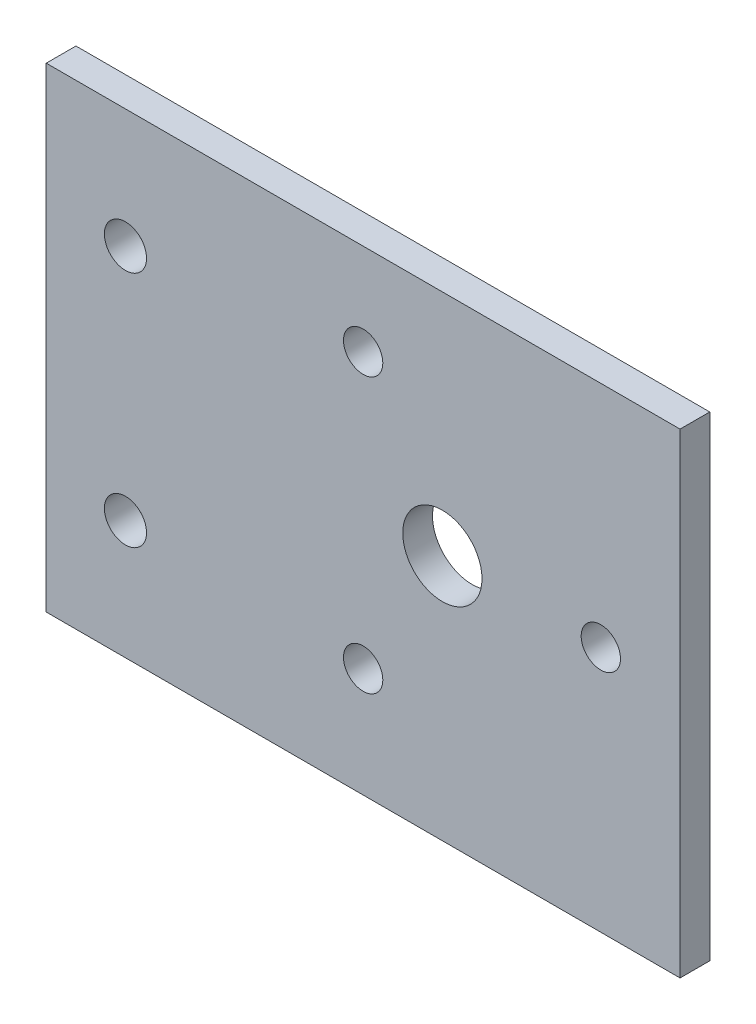
ISO-10303-21;
HEADER;
FILE_DESCRIPTION(('STEP AP214'),'2;1');
FILE_NAME('part.step','',(''),(''),'','','');
FILE_SCHEMA(('AUTOMOTIVE_DESIGN { 1 0 10303 214 1 1 1 1 }'));
ENDSEC;
DATA;
#1=APPLICATION_CONTEXT('core data for automotive mechanical design processes');
#2=APPLICATION_PROTOCOL_DEFINITION('international standard','automotive_design',2000,#1);
#3=PRODUCT_CONTEXT('',#1,'mechanical');
#4=PRODUCT('Part','Part','',(#3));
#5=PRODUCT_RELATED_PRODUCT_CATEGORY('part','',(#4));
#6=PRODUCT_DEFINITION_FORMATION('','',#4);
#7=PRODUCT_DEFINITION_CONTEXT('part definition',#1,'design');
#8=PRODUCT_DEFINITION('design','',#6,#7);
#9=PRODUCT_DEFINITION_SHAPE('','',#8);
#10=(LENGTH_UNIT() NAMED_UNIT(*) SI_UNIT(.MILLI.,.METRE.));
#11=(NAMED_UNIT(*) PLANE_ANGLE_UNIT() SI_UNIT($,.RADIAN.));
#12=(NAMED_UNIT(*) SI_UNIT($,.STERADIAN.) SOLID_ANGLE_UNIT());
#13=UNCERTAINTY_MEASURE_WITH_UNIT(LENGTH_MEASURE(1.E-05),#10,'distance_accuracy_value','');
#14=(GEOMETRIC_REPRESENTATION_CONTEXT(3) GLOBAL_UNCERTAINTY_ASSIGNED_CONTEXT((#13)) GLOBAL_UNIT_ASSIGNED_CONTEXT((#10,
#11,#12)) REPRESENTATION_CONTEXT('',''));
#15=CARTESIAN_POINT('',(0.,0.,0.));
#16=DIRECTION('',(0.,0.,1.));
#17=DIRECTION('',(1.,0.,0.));
#18=AXIS2_PLACEMENT_3D('',#15,#16,#17);
#19=CARTESIAN_POINT('',(0.,76.2,4.7625));
#20=DIRECTION('',(1.,0.,0.));
#21=DIRECTION('',(0.,0.,-1.));
#22=AXIS2_PLACEMENT_3D('',#19,#20,#21);
#23=PLANE('',#22);
#24=DIRECTION('',(0.,-1.,0.));
#25=VECTOR('',#24,1.);
#26=CARTESIAN_POINT('',(0.,76.2,0.));
#27=LINE('',#26,#25);
#28=CARTESIAN_POINT('',(0.,76.2,0.));
#29=VERTEX_POINT('',#28);
#30=CARTESIAN_POINT('',(0.,0.,0.));
#31=VERTEX_POINT('',#30);
#32=EDGE_CURVE('E95',#29,#31,#27,.T.);
#33=ORIENTED_EDGE('',*,*,#32,.T.);
#34=DIRECTION('',(0.,0.,-1.));
#35=VECTOR('',#34,1.);
#36=CARTESIAN_POINT('',(0.,0.,4.7625));
#37=LINE('',#36,#35);
#38=CARTESIAN_POINT('',(0.,0.,4.7625));
#39=VERTEX_POINT('',#38);
#40=EDGE_CURVE('E11',#39,#31,#37,.T.);
#41=ORIENTED_EDGE('',*,*,#40,.F.);
#42=DIRECTION('',(0.,-1.,0.));
#43=VECTOR('',#42,1.);
#44=CARTESIAN_POINT('',(0.,76.2,4.7625));
#45=LINE('',#44,#43);
#46=CARTESIAN_POINT('',(0.,76.2,4.7625));
#47=VERTEX_POINT('',#46);
#48=EDGE_CURVE('E83',#47,#39,#45,.T.);
#49=ORIENTED_EDGE('',*,*,#48,.F.);
#50=DIRECTION('',(0.,0.,-1.));
#51=VECTOR('',#50,1.);
#52=CARTESIAN_POINT('',(0.,76.2,4.7625));
#53=LINE('',#52,#51);
#54=EDGE_CURVE('E91',#47,#29,#53,.T.);
#55=ORIENTED_EDGE('',*,*,#54,.T.);
#56=EDGE_LOOP('',(#33,#41,#49,#55));
#57=FACE_BOUND('',#56,.T.);
#58=ADVANCED_FACE('F32',(#57),#23,.F.);
#59=CARTESIAN_POINT('',(0.,0.,4.7625));
#60=DIRECTION('',(0.,1.,0.));
#61=DIRECTION('',(0.,0.,1.));
#62=AXIS2_PLACEMENT_3D('',#59,#60,#61);
#63=PLANE('',#62);
#64=DIRECTION('',(1.,0.,0.));
#65=VECTOR('',#64,1.);
#66=CARTESIAN_POINT('',(0.,0.,0.));
#67=LINE('',#66,#65);
#68=CARTESIAN_POINT('',(101.6,0.,0.));
#69=VERTEX_POINT('',#68);
#70=EDGE_CURVE('E87',#31,#69,#67,.T.);
#71=ORIENTED_EDGE('',*,*,#70,.T.);
#72=DIRECTION('',(0.,0.,-1.));
#73=VECTOR('',#72,1.);
#74=CARTESIAN_POINT('',(101.6,0.,4.7625));
#75=LINE('',#74,#73);
#76=CARTESIAN_POINT('',(101.6,0.,4.7625));
#77=VERTEX_POINT('',#76);
#78=EDGE_CURVE('E40',#77,#69,#75,.T.);
#79=ORIENTED_EDGE('',*,*,#78,.F.);
#80=DIRECTION('',(1.,0.,0.));
#81=VECTOR('',#80,1.);
#82=CARTESIAN_POINT('',(0.,0.,4.7625));
#83=LINE('',#82,#81);
#84=EDGE_CURVE('E78',#39,#77,#83,.T.);
#85=ORIENTED_EDGE('',*,*,#84,.F.);
#86=ORIENTED_EDGE('',*,*,#40,.T.);
#87=EDGE_LOOP('',(#71,#79,#85,#86));
#88=FACE_BOUND('',#87,.T.);
#89=ADVANCED_FACE('F86',(#88),#63,.F.);
#90=CARTESIAN_POINT('',(101.6,0.,4.7625));
#91=DIRECTION('',(-1.,0.,0.));
#92=DIRECTION('',(0.,0.,1.));
#93=AXIS2_PLACEMENT_3D('',#90,#91,#92);
#94=PLANE('',#93);
#95=DIRECTION('',(0.,1.,0.));
#96=VECTOR('',#95,1.);
#97=CARTESIAN_POINT('',(101.6,0.,0.));
#98=LINE('',#97,#96);
#99=CARTESIAN_POINT('',(101.6,76.2,0.));
#100=VERTEX_POINT('',#99);
#101=EDGE_CURVE('E65',#69,#100,#98,.T.);
#102=ORIENTED_EDGE('',*,*,#101,.T.);
#103=DIRECTION('',(0.,0.,-1.));
#104=VECTOR('',#103,1.);
#105=CARTESIAN_POINT('',(101.6,76.2,4.7625));
#106=LINE('',#105,#104);
#107=CARTESIAN_POINT('',(101.6,76.2,4.7625));
#108=VERTEX_POINT('',#107);
#109=EDGE_CURVE('E88',#108,#100,#106,.T.);
#110=ORIENTED_EDGE('',*,*,#109,.F.);
#111=DIRECTION('',(0.,1.,0.));
#112=VECTOR('',#111,1.);
#113=CARTESIAN_POINT('',(101.6,0.,4.7625));
#114=LINE('',#113,#112);
#115=EDGE_CURVE('E81',#77,#108,#114,.T.);
#116=ORIENTED_EDGE('',*,*,#115,.F.);
#117=ORIENTED_EDGE('',*,*,#78,.T.);
#118=EDGE_LOOP('',(#102,#110,#116,#117));
#119=FACE_BOUND('',#118,.T.);
#120=ADVANCED_FACE('F89',(#119),#94,.F.);
#121=CARTESIAN_POINT('',(101.6,76.2,4.7625));
#122=DIRECTION('',(0.,-1.,0.));
#123=DIRECTION('',(1.,0.,0.));
#124=AXIS2_PLACEMENT_3D('',#121,#122,#123);
#125=PLANE('',#124);
#126=DIRECTION('',(-1.,0.,0.));
#127=VECTOR('',#126,1.);
#128=CARTESIAN_POINT('',(101.6,76.2,0.));
#129=LINE('',#128,#127);
#130=EDGE_CURVE('E71',#100,#29,#129,.T.);
#131=ORIENTED_EDGE('',*,*,#130,.T.);
#132=ORIENTED_EDGE('',*,*,#54,.F.);
#133=DIRECTION('',(-1.,0.,0.));
#134=VECTOR('',#133,1.);
#135=CARTESIAN_POINT('',(101.6,76.2,4.7625));
#136=LINE('',#135,#134);
#137=EDGE_CURVE('E48',#108,#47,#136,.T.);
#138=ORIENTED_EDGE('',*,*,#137,.F.);
#139=ORIENTED_EDGE('',*,*,#109,.T.);
#140=EDGE_LOOP('',(#131,#132,#138,#139));
#141=FACE_BOUND('',#140,.T.);
#142=ADVANCED_FACE('F103',(#141),#125,.F.);
#143=CARTESIAN_POINT('',(0.,0.,4.7625));
#144=DIRECTION('',(0.,0.,1.));
#145=DIRECTION('',(1.,0.,0.));
#146=AXIS2_PLACEMENT_3D('',#143,#144,#145);
#147=PLANE('',#146);
#148=CARTESIAN_POINT('',(50.8,17.5498317487821,4.7625));
#149=DIRECTION('',(0.,0.,1.));
#150=DIRECTION('',(1.,0.,0.));
#151=AXIS2_PLACEMENT_3D('',#148,#149,#150);
#152=CIRCLE('',#151,3.1500064);
#153=CARTESIAN_POINT('',(53.9500064,17.5498317487821,4.7625));
#154=VERTEX_POINT('',#153);
#155=EDGE_CURVE('E127',#154,#154,#152,.T.);
#156=ORIENTED_EDGE('',*,*,#155,.F.);
#157=EDGE_LOOP('',(#156));
#158=FACE_BOUND('',#157,.T.);
#159=CARTESIAN_POINT('',(88.8999999999999,39.5468770049069,4.7625));
#160=DIRECTION('',(0.,0.,1.));
#161=DIRECTION('',(1.,0.,0.));
#162=AXIS2_PLACEMENT_3D('',#159,#160,#161);
#163=CIRCLE('',#162,3.1500064);
#164=CARTESIAN_POINT('',(92.0500063999999,39.5468770049069,4.7625));
#165=VERTEX_POINT('',#164);
#166=EDGE_CURVE('E133',#165,#165,#163,.T.);
#167=ORIENTED_EDGE('',*,*,#166,.F.);
#168=EDGE_LOOP('',(#167));
#169=FACE_BOUND('',#168,.T.);
#170=CARTESIAN_POINT('',(50.7999999999999,61.5439222610316,4.7625));
#171=DIRECTION('',(0.,0.,1.));
#172=DIRECTION('',(1.,0.,0.));
#173=AXIS2_PLACEMENT_3D('',#170,#171,#172);
#174=CIRCLE('',#173,3.1500064);
#175=CARTESIAN_POINT('',(53.9500063999999,61.5439222610316,4.7625));
#176=VERTEX_POINT('',#175);
#177=EDGE_CURVE('E139',#176,#176,#174,.T.);
#178=ORIENTED_EDGE('',*,*,#177,.F.);
#179=EDGE_LOOP('',(#178));
#180=FACE_BOUND('',#179,.T.);
#181=CARTESIAN_POINT('',(63.5,39.5468770049069,4.7625));
#182=DIRECTION('',(0.,0.,1.));
#183=DIRECTION('',(1.,0.,0.));
#184=AXIS2_PLACEMENT_3D('',#181,#182,#183);
#185=CIRCLE('',#184,6.35);
#186=CARTESIAN_POINT('',(69.85,39.5468770049069,4.7625));
#187=VERTEX_POINT('',#186);
#188=EDGE_CURVE('E121',#187,#187,#185,.T.);
#189=ORIENTED_EDGE('',*,*,#188,.F.);
#190=EDGE_LOOP('',(#189));
#191=FACE_BOUND('',#190,.T.);
#192=CARTESIAN_POINT('',(12.7,57.15,4.7625));
#193=DIRECTION('',(0.,0.,1.));
#194=DIRECTION('',(1.,0.,0.));
#195=AXIS2_PLACEMENT_3D('',#192,#193,#194);
#196=CIRCLE('',#195,3.3782);
#197=CARTESIAN_POINT('',(16.0782,57.15,4.7625));
#198=VERTEX_POINT('',#197);
#199=EDGE_CURVE('E116',#198,#198,#196,.T.);
#200=ORIENTED_EDGE('',*,*,#199,.F.);
#201=EDGE_LOOP('',(#200));
#202=FACE_BOUND('',#201,.T.);
#203=CARTESIAN_POINT('',(12.7,19.05,4.7625));
#204=DIRECTION('',(0.,0.,1.));
#205=DIRECTION('',(1.,0.,0.));
#206=AXIS2_PLACEMENT_3D('',#203,#204,#205);
#207=CIRCLE('',#206,3.3782);
#208=CARTESIAN_POINT('',(16.0782,19.05,4.7625));
#209=VERTEX_POINT('',#208);
#210=EDGE_CURVE('E109',#209,#209,#207,.T.);
#211=ORIENTED_EDGE('',*,*,#210,.F.);
#212=EDGE_LOOP('',(#211));
#213=FACE_BOUND('',#212,.T.);
#214=ORIENTED_EDGE('',*,*,#48,.T.);
#215=ORIENTED_EDGE('',*,*,#84,.T.);
#216=ORIENTED_EDGE('',*,*,#115,.T.);
#217=ORIENTED_EDGE('',*,*,#137,.T.);
#218=EDGE_LOOP('',(#214,#215,#216,#217));
#219=FACE_BOUND('',#218,.T.);
#220=ADVANCED_FACE('F79',(#158,#169,#180,#191,#202,#213,#219),#147,.T.);
#221=CARTESIAN_POINT('',(0.,0.,0.));
#222=DIRECTION('',(0.,0.,1.));
#223=DIRECTION('',(1.,0.,0.));
#224=AXIS2_PLACEMENT_3D('',#221,#222,#223);
#225=PLANE('',#224);
#226=CARTESIAN_POINT('',(50.8,17.5498317487821,0.));
#227=DIRECTION('',(0.,0.,1.));
#228=DIRECTION('',(1.,0.,0.));
#229=AXIS2_PLACEMENT_3D('',#226,#227,#228);
#230=CIRCLE('',#229,3.1500064);
#231=CARTESIAN_POINT('',(53.9500064,17.5498317487821,0.));
#232=VERTEX_POINT('',#231);
#233=EDGE_CURVE('E130',#232,#232,#230,.T.);
#234=ORIENTED_EDGE('',*,*,#233,.T.);
#235=EDGE_LOOP('',(#234));
#236=FACE_BOUND('',#235,.T.);
#237=CARTESIAN_POINT('',(88.8999999999999,39.5468770049069,0.));
#238=DIRECTION('',(0.,0.,1.));
#239=DIRECTION('',(1.,0.,0.));
#240=AXIS2_PLACEMENT_3D('',#237,#238,#239);
#241=CIRCLE('',#240,3.1500064);
#242=CARTESIAN_POINT('',(92.0500063999999,39.5468770049069,0.));
#243=VERTEX_POINT('',#242);
#244=EDGE_CURVE('E136',#243,#243,#241,.T.);
#245=ORIENTED_EDGE('',*,*,#244,.T.);
#246=EDGE_LOOP('',(#245));
#247=FACE_BOUND('',#246,.T.);
#248=CARTESIAN_POINT('',(50.7999999999999,61.5439222610316,0.));
#249=DIRECTION('',(0.,0.,1.));
#250=DIRECTION('',(1.,0.,0.));
#251=AXIS2_PLACEMENT_3D('',#248,#249,#250);
#252=CIRCLE('',#251,3.1500064);
#253=CARTESIAN_POINT('',(53.9500063999999,61.5439222610316,0.));
#254=VERTEX_POINT('',#253);
#255=EDGE_CURVE('E124',#254,#254,#252,.T.);
#256=ORIENTED_EDGE('',*,*,#255,.T.);
#257=EDGE_LOOP('',(#256));
#258=FACE_BOUND('',#257,.T.);
#259=CARTESIAN_POINT('',(63.5,39.5468770049069,0.));
#260=DIRECTION('',(0.,0.,1.));
#261=DIRECTION('',(1.,0.,0.));
#262=AXIS2_PLACEMENT_3D('',#259,#260,#261);
#263=CIRCLE('',#262,6.35);
#264=CARTESIAN_POINT('',(69.85,39.5468770049069,0.));
#265=VERTEX_POINT('',#264);
#266=EDGE_CURVE('E113',#265,#265,#263,.T.);
#267=ORIENTED_EDGE('',*,*,#266,.T.);
#268=EDGE_LOOP('',(#267));
#269=FACE_BOUND('',#268,.T.);
#270=CARTESIAN_POINT('',(12.7,57.15,0.));
#271=DIRECTION('',(0.,0.,1.));
#272=DIRECTION('',(1.,0.,0.));
#273=AXIS2_PLACEMENT_3D('',#270,#271,#272);
#274=CIRCLE('',#273,3.3782);
#275=CARTESIAN_POINT('',(16.0782,57.15,0.));
#276=VERTEX_POINT('',#275);
#277=EDGE_CURVE('E98',#276,#276,#274,.T.);
#278=ORIENTED_EDGE('',*,*,#277,.T.);
#279=EDGE_LOOP('',(#278));
#280=FACE_BOUND('',#279,.T.);
#281=CARTESIAN_POINT('',(12.7,19.05,0.));
#282=DIRECTION('',(0.,0.,1.));
#283=DIRECTION('',(1.,0.,0.));
#284=AXIS2_PLACEMENT_3D('',#281,#282,#283);
#285=CIRCLE('',#284,3.3782);
#286=CARTESIAN_POINT('',(16.0782,19.05,0.));
#287=VERTEX_POINT('',#286);
#288=EDGE_CURVE('E112',#287,#287,#285,.T.);
#289=ORIENTED_EDGE('',*,*,#288,.T.);
#290=EDGE_LOOP('',(#289));
#291=FACE_BOUND('',#290,.T.);
#292=ORIENTED_EDGE('',*,*,#32,.F.);
#293=ORIENTED_EDGE('',*,*,#130,.F.);
#294=ORIENTED_EDGE('',*,*,#101,.F.);
#295=ORIENTED_EDGE('',*,*,#70,.F.);
#296=EDGE_LOOP('',(#292,#293,#294,#295));
#297=FACE_BOUND('',#296,.T.);
#298=ADVANCED_FACE('F106',(#236,#247,#258,#269,#280,#291,#297),#225,.F.);
#299=CARTESIAN_POINT('',(12.7,19.05,0.));
#300=DIRECTION('',(0.,0.,1.));
#301=DIRECTION('',(1.,0.,0.));
#302=AXIS2_PLACEMENT_3D('',#299,#300,#301);
#303=CYLINDRICAL_SURFACE('',#302,3.3782);
#304=CARTESIAN_POINT('',(16.0782,19.05,0.));
#305=CARTESIAN_POINT('',(16.0782,19.05,0.049609375));
#306=CARTESIAN_POINT('',(16.0782,19.05,0.09921875));
#307=CARTESIAN_POINT('',(16.0782,19.05,0.1984375));
#308=CARTESIAN_POINT('',(16.0782,19.05,0.248046875));
#309=CARTESIAN_POINT('',(16.0782,19.05,0.347265625));
#310=CARTESIAN_POINT('',(16.0782,19.05,0.396875));
#311=CARTESIAN_POINT('',(16.0782,19.05,0.49609375));
#312=CARTESIAN_POINT('',(16.0782,19.05,0.545703125));
#313=CARTESIAN_POINT('',(16.0782,19.05,0.644921875));
#314=CARTESIAN_POINT('',(16.0782,19.05,0.69453125));
#315=CARTESIAN_POINT('',(16.0782,19.05,0.79375));
#316=CARTESIAN_POINT('',(16.0782,19.05,0.843359375));
#317=CARTESIAN_POINT('',(16.0782,19.05,0.942578125));
#318=CARTESIAN_POINT('',(16.0782,19.05,0.9921875));
#319=CARTESIAN_POINT('',(16.0782,19.05,1.09140625));
#320=CARTESIAN_POINT('',(16.0782,19.05,1.141015625));
#321=CARTESIAN_POINT('',(16.0782,19.05,1.240234375));
#322=CARTESIAN_POINT('',(16.0782,19.05,1.28984375));
#323=CARTESIAN_POINT('',(16.0782,19.05,1.3890625));
#324=CARTESIAN_POINT('',(16.0782,19.05,1.438671875));
#325=CARTESIAN_POINT('',(16.0782,19.05,1.537890625));
#326=CARTESIAN_POINT('',(16.0782,19.05,1.5875));
#327=CARTESIAN_POINT('',(16.0782,19.05,1.68671875));
#328=CARTESIAN_POINT('',(16.0782,19.05,1.736328125));
#329=CARTESIAN_POINT('',(16.0782,19.05,1.835546875));
#330=CARTESIAN_POINT('',(16.0782,19.05,1.88515625));
#331=CARTESIAN_POINT('',(16.0782,19.05,1.984375));
#332=CARTESIAN_POINT('',(16.0782,19.05,2.033984375));
#333=CARTESIAN_POINT('',(16.0782,19.05,2.133203125));
#334=CARTESIAN_POINT('',(16.0782,19.05,2.1828125));
#335=CARTESIAN_POINT('',(16.0782,19.05,2.28203125));
#336=CARTESIAN_POINT('',(16.0782,19.05,2.331640625));
#337=CARTESIAN_POINT('',(16.0782,19.05,2.430859375));
#338=CARTESIAN_POINT('',(16.0782,19.05,2.48046875));
#339=CARTESIAN_POINT('',(16.0782,19.05,2.5796875));
#340=CARTESIAN_POINT('',(16.0782,19.05,2.629296875));
#341=CARTESIAN_POINT('',(16.0782,19.05,2.728515625));
#342=CARTESIAN_POINT('',(16.0782,19.05,2.778125));
#343=CARTESIAN_POINT('',(16.0782,19.05,2.87734375));
#344=CARTESIAN_POINT('',(16.0782,19.05,2.926953125));
#345=CARTESIAN_POINT('',(16.0782,19.05,3.026171875));
#346=CARTESIAN_POINT('',(16.0782,19.05,3.07578125));
#347=CARTESIAN_POINT('',(16.0782,19.05,3.175));
#348=CARTESIAN_POINT('',(16.0782,19.05,3.224609375));
#349=CARTESIAN_POINT('',(16.0782,19.05,3.323828125));
#350=CARTESIAN_POINT('',(16.0782,19.05,3.3734375));
#351=CARTESIAN_POINT('',(16.0782,19.05,3.47265625));
#352=CARTESIAN_POINT('',(16.0782,19.05,3.522265625));
#353=CARTESIAN_POINT('',(16.0782,19.05,3.621484375));
#354=CARTESIAN_POINT('',(16.0782,19.05,3.67109375));
#355=CARTESIAN_POINT('',(16.0782,19.05,3.7703125));
#356=CARTESIAN_POINT('',(16.0782,19.05,3.819921875));
#357=CARTESIAN_POINT('',(16.0782,19.05,3.919140625));
#358=CARTESIAN_POINT('',(16.0782,19.05,3.96875));
#359=CARTESIAN_POINT('',(16.0782,19.05,4.06796875));
#360=CARTESIAN_POINT('',(16.0782,19.05,4.117578125));
#361=CARTESIAN_POINT('',(16.0782,19.05,4.216796875));
#362=CARTESIAN_POINT('',(16.0782,19.05,4.26640625));
#363=CARTESIAN_POINT('',(16.0782,19.05,4.365625));
#364=CARTESIAN_POINT('',(16.0782,19.05,4.415234375));
#365=CARTESIAN_POINT('',(16.0782,19.05,4.514453125));
#366=CARTESIAN_POINT('',(16.0782,19.05,4.5640625));
#367=CARTESIAN_POINT('',(16.0782,19.05,4.66328125));
#368=CARTESIAN_POINT('',(16.0782,19.05,4.712890625));
#369=CARTESIAN_POINT('',(16.0782,19.05,4.7625));
#370=B_SPLINE_CURVE_WITH_KNOTS('',3,(#304,#305,#306,#307,#308,#309,#310,#311,#312,#313,#314,
#315,#316,#317,#318,#319,#320,#321,#322,#323,#324,#325,#326,#327,#328,#329,#330,#331,#332,#333,
#334,#335,#336,#337,#338,#339,#340,#341,#342,#343,#344,#345,#346,#347,#348,#349,#350,#351,#352,
#353,#354,#355,#356,#357,#358,#359,#360,#361,#362,#363,#364,#365,#366,#367,#368,#369),
.UNSPECIFIED.,.F.,.F.,(4,2,2,2,2,2,2,2,2,2,2,2,2,2,2,2,2,2,2,2,2,2,2,2,2,2,2,2,2,2,2,2,4),(0.,
0.148828125,0.29765625,0.446484375,0.5953125,0.744140625,0.89296875,1.041796875,1.190625,
1.339453125,1.48828125,1.637109375,1.7859375,1.934765625,2.08359375,2.232421875,2.38125,
2.530078125,2.67890625,2.827734375,2.9765625,3.125390625,3.27421875,3.423046875,3.571875,
3.720703125,3.86953125,4.018359375,4.1671875,4.316015625,4.46484375,4.613671875,4.7625),.UNSPECIFIED.);
#371=EDGE_CURVE('BSEAM165',#287,#209,#370,.T.);
#372=ORIENTED_EDGE('',*,*,#288,.F.);
#373=ORIENTED_EDGE('',*,*,#210,.T.);
#374=ORIENTED_EDGE('',*,*,#371,.T.);
#375=ORIENTED_EDGE('',*,*,#371,.F.);
#376=EDGE_LOOP('',(#372,#374,#373,#375));
#377=FACE_BOUND('',#376,.T.);
#378=ADVANCED_FACE('F165',(#377),#303,.F.);
#379=CARTESIAN_POINT('',(12.7,57.15,0.));
#380=DIRECTION('',(0.,0.,1.));
#381=DIRECTION('',(1.,0.,0.));
#382=AXIS2_PLACEMENT_3D('',#379,#380,#381);
#383=CYLINDRICAL_SURFACE('',#382,3.3782);
#384=CARTESIAN_POINT('',(16.0782,57.15,0.));
#385=CARTESIAN_POINT('',(16.0782,57.15,0.049609375));
#386=CARTESIAN_POINT('',(16.0782,57.15,0.09921875));
#387=CARTESIAN_POINT('',(16.0782,57.15,0.1984375));
#388=CARTESIAN_POINT('',(16.0782,57.15,0.248046875));
#389=CARTESIAN_POINT('',(16.0782,57.15,0.347265625));
#390=CARTESIAN_POINT('',(16.0782,57.15,0.396875));
#391=CARTESIAN_POINT('',(16.0782,57.15,0.49609375));
#392=CARTESIAN_POINT('',(16.0782,57.15,0.545703125));
#393=CARTESIAN_POINT('',(16.0782,57.15,0.644921875));
#394=CARTESIAN_POINT('',(16.0782,57.15,0.69453125));
#395=CARTESIAN_POINT('',(16.0782,57.15,0.79375));
#396=CARTESIAN_POINT('',(16.0782,57.15,0.843359375));
#397=CARTESIAN_POINT('',(16.0782,57.15,0.942578125));
#398=CARTESIAN_POINT('',(16.0782,57.15,0.9921875));
#399=CARTESIAN_POINT('',(16.0782,57.15,1.09140625));
#400=CARTESIAN_POINT('',(16.0782,57.15,1.141015625));
#401=CARTESIAN_POINT('',(16.0782,57.15,1.240234375));
#402=CARTESIAN_POINT('',(16.0782,57.15,1.28984375));
#403=CARTESIAN_POINT('',(16.0782,57.15,1.3890625));
#404=CARTESIAN_POINT('',(16.0782,57.15,1.438671875));
#405=CARTESIAN_POINT('',(16.0782,57.15,1.537890625));
#406=CARTESIAN_POINT('',(16.0782,57.15,1.5875));
#407=CARTESIAN_POINT('',(16.0782,57.15,1.68671875));
#408=CARTESIAN_POINT('',(16.0782,57.15,1.736328125));
#409=CARTESIAN_POINT('',(16.0782,57.15,1.835546875));
#410=CARTESIAN_POINT('',(16.0782,57.15,1.88515625));
#411=CARTESIAN_POINT('',(16.0782,57.15,1.984375));
#412=CARTESIAN_POINT('',(16.0782,57.15,2.033984375));
#413=CARTESIAN_POINT('',(16.0782,57.15,2.133203125));
#414=CARTESIAN_POINT('',(16.0782,57.15,2.1828125));
#415=CARTESIAN_POINT('',(16.0782,57.15,2.28203125));
#416=CARTESIAN_POINT('',(16.0782,57.15,2.331640625));
#417=CARTESIAN_POINT('',(16.0782,57.15,2.430859375));
#418=CARTESIAN_POINT('',(16.0782,57.15,2.48046875));
#419=CARTESIAN_POINT('',(16.0782,57.15,2.5796875));
#420=CARTESIAN_POINT('',(16.0782,57.15,2.629296875));
#421=CARTESIAN_POINT('',(16.0782,57.15,2.728515625));
#422=CARTESIAN_POINT('',(16.0782,57.15,2.778125));
#423=CARTESIAN_POINT('',(16.0782,57.15,2.87734375));
#424=CARTESIAN_POINT('',(16.0782,57.15,2.926953125));
#425=CARTESIAN_POINT('',(16.0782,57.15,3.026171875));
#426=CARTESIAN_POINT('',(16.0782,57.15,3.07578125));
#427=CARTESIAN_POINT('',(16.0782,57.15,3.175));
#428=CARTESIAN_POINT('',(16.0782,57.15,3.224609375));
#429=CARTESIAN_POINT('',(16.0782,57.15,3.323828125));
#430=CARTESIAN_POINT('',(16.0782,57.15,3.3734375));
#431=CARTESIAN_POINT('',(16.0782,57.15,3.47265625));
#432=CARTESIAN_POINT('',(16.0782,57.15,3.522265625));
#433=CARTESIAN_POINT('',(16.0782,57.15,3.621484375));
#434=CARTESIAN_POINT('',(16.0782,57.15,3.67109375));
#435=CARTESIAN_POINT('',(16.0782,57.15,3.7703125));
#436=CARTESIAN_POINT('',(16.0782,57.15,3.819921875));
#437=CARTESIAN_POINT('',(16.0782,57.15,3.919140625));
#438=CARTESIAN_POINT('',(16.0782,57.15,3.96875));
#439=CARTESIAN_POINT('',(16.0782,57.15,4.06796875));
#440=CARTESIAN_POINT('',(16.0782,57.15,4.117578125));
#441=CARTESIAN_POINT('',(16.0782,57.15,4.216796875));
#442=CARTESIAN_POINT('',(16.0782,57.15,4.26640625));
#443=CARTESIAN_POINT('',(16.0782,57.15,4.365625));
#444=CARTESIAN_POINT('',(16.0782,57.15,4.415234375));
#445=CARTESIAN_POINT('',(16.0782,57.15,4.514453125));
#446=CARTESIAN_POINT('',(16.0782,57.15,4.5640625));
#447=CARTESIAN_POINT('',(16.0782,57.15,4.66328125));
#448=CARTESIAN_POINT('',(16.0782,57.15,4.712890625));
#449=CARTESIAN_POINT('',(16.0782,57.15,4.7625));
#450=B_SPLINE_CURVE_WITH_KNOTS('',3,(#384,#385,#386,#387,#388,#389,#390,#391,#392,#393,#394,
#395,#396,#397,#398,#399,#400,#401,#402,#403,#404,#405,#406,#407,#408,#409,#410,#411,#412,#413,
#414,#415,#416,#417,#418,#419,#420,#421,#422,#423,#424,#425,#426,#427,#428,#429,#430,#431,#432,
#433,#434,#435,#436,#437,#438,#439,#440,#441,#442,#443,#444,#445,#446,#447,#448,#449),
.UNSPECIFIED.,.F.,.F.,(4,2,2,2,2,2,2,2,2,2,2,2,2,2,2,2,2,2,2,2,2,2,2,2,2,2,2,2,2,2,2,2,4),(0.,
0.148828125,0.29765625,0.446484375,0.5953125,0.744140625,0.89296875,1.041796875,1.190625,
1.339453125,1.48828125,1.637109375,1.7859375,1.934765625,2.08359375,2.232421875,2.38125,
2.530078125,2.67890625,2.827734375,2.9765625,3.125390625,3.27421875,3.423046875,3.571875,
3.720703125,3.86953125,4.018359375,4.1671875,4.316015625,4.46484375,4.613671875,4.7625),.UNSPECIFIED.);
#451=EDGE_CURVE('BSEAM167',#276,#198,#450,.T.);
#452=ORIENTED_EDGE('',*,*,#277,.F.);
#453=ORIENTED_EDGE('',*,*,#199,.T.);
#454=ORIENTED_EDGE('',*,*,#451,.T.);
#455=ORIENTED_EDGE('',*,*,#451,.F.);
#456=EDGE_LOOP('',(#452,#454,#453,#455));
#457=FACE_BOUND('',#456,.T.);
#458=ADVANCED_FACE('F167',(#457),#383,.F.);
#459=CARTESIAN_POINT('',(63.5,39.5468770049069,0.));
#460=DIRECTION('',(0.,0.,1.));
#461=DIRECTION('',(1.,0.,0.));
#462=AXIS2_PLACEMENT_3D('',#459,#460,#461);
#463=CYLINDRICAL_SURFACE('',#462,6.35);
#464=CARTESIAN_POINT('',(69.85,39.5468770049069,0.));
#465=CARTESIAN_POINT('',(69.85,39.5468770049069,0.049609375));
#466=CARTESIAN_POINT('',(69.85,39.5468770049069,0.09921875));
#467=CARTESIAN_POINT('',(69.85,39.5468770049069,0.1984375));
#468=CARTESIAN_POINT('',(69.85,39.5468770049069,0.248046875));
#469=CARTESIAN_POINT('',(69.85,39.5468770049069,0.347265625));
#470=CARTESIAN_POINT('',(69.85,39.5468770049069,0.396875));
#471=CARTESIAN_POINT('',(69.85,39.5468770049069,0.49609375));
#472=CARTESIAN_POINT('',(69.85,39.5468770049069,0.545703125));
#473=CARTESIAN_POINT('',(69.85,39.5468770049069,0.644921875));
#474=CARTESIAN_POINT('',(69.85,39.5468770049069,0.69453125));
#475=CARTESIAN_POINT('',(69.85,39.5468770049069,0.79375));
#476=CARTESIAN_POINT('',(69.85,39.5468770049069,0.843359375));
#477=CARTESIAN_POINT('',(69.85,39.5468770049069,0.942578125));
#478=CARTESIAN_POINT('',(69.85,39.5468770049069,0.9921875));
#479=CARTESIAN_POINT('',(69.85,39.5468770049069,1.09140625));
#480=CARTESIAN_POINT('',(69.85,39.5468770049069,1.141015625));
#481=CARTESIAN_POINT('',(69.85,39.5468770049069,1.240234375));
#482=CARTESIAN_POINT('',(69.85,39.5468770049069,1.28984375));
#483=CARTESIAN_POINT('',(69.85,39.5468770049069,1.3890625));
#484=CARTESIAN_POINT('',(69.85,39.5468770049069,1.438671875));
#485=CARTESIAN_POINT('',(69.85,39.5468770049069,1.537890625));
#486=CARTESIAN_POINT('',(69.85,39.5468770049069,1.5875));
#487=CARTESIAN_POINT('',(69.85,39.5468770049069,1.68671875));
#488=CARTESIAN_POINT('',(69.85,39.5468770049069,1.736328125));
#489=CARTESIAN_POINT('',(69.85,39.5468770049069,1.835546875));
#490=CARTESIAN_POINT('',(69.85,39.5468770049069,1.88515625));
#491=CARTESIAN_POINT('',(69.85,39.5468770049069,1.984375));
#492=CARTESIAN_POINT('',(69.85,39.5468770049069,2.033984375));
#493=CARTESIAN_POINT('',(69.85,39.5468770049069,2.133203125));
#494=CARTESIAN_POINT('',(69.85,39.5468770049069,2.1828125));
#495=CARTESIAN_POINT('',(69.85,39.5468770049069,2.28203125));
#496=CARTESIAN_POINT('',(69.85,39.5468770049069,2.331640625));
#497=CARTESIAN_POINT('',(69.85,39.5468770049069,2.430859375));
#498=CARTESIAN_POINT('',(69.85,39.5468770049069,2.48046875));
#499=CARTESIAN_POINT('',(69.85,39.5468770049069,2.5796875));
#500=CARTESIAN_POINT('',(69.85,39.5468770049069,2.629296875));
#501=CARTESIAN_POINT('',(69.85,39.5468770049069,2.728515625));
#502=CARTESIAN_POINT('',(69.85,39.5468770049069,2.778125));
#503=CARTESIAN_POINT('',(69.85,39.5468770049069,2.87734375));
#504=CARTESIAN_POINT('',(69.85,39.5468770049069,2.926953125));
#505=CARTESIAN_POINT('',(69.85,39.5468770049069,3.026171875));
#506=CARTESIAN_POINT('',(69.85,39.5468770049069,3.07578125));
#507=CARTESIAN_POINT('',(69.85,39.5468770049069,3.175));
#508=CARTESIAN_POINT('',(69.85,39.5468770049069,3.224609375));
#509=CARTESIAN_POINT('',(69.85,39.5468770049069,3.323828125));
#510=CARTESIAN_POINT('',(69.85,39.5468770049069,3.3734375));
#511=CARTESIAN_POINT('',(69.85,39.5468770049069,3.47265625));
#512=CARTESIAN_POINT('',(69.85,39.5468770049069,3.522265625));
#513=CARTESIAN_POINT('',(69.85,39.5468770049069,3.621484375));
#514=CARTESIAN_POINT('',(69.85,39.5468770049069,3.67109375));
#515=CARTESIAN_POINT('',(69.85,39.5468770049069,3.7703125));
#516=CARTESIAN_POINT('',(69.85,39.5468770049069,3.819921875));
#517=CARTESIAN_POINT('',(69.85,39.5468770049069,3.919140625));
#518=CARTESIAN_POINT('',(69.85,39.5468770049069,3.96875));
#519=CARTESIAN_POINT('',(69.85,39.5468770049069,4.06796875));
#520=CARTESIAN_POINT('',(69.85,39.5468770049069,4.117578125));
#521=CARTESIAN_POINT('',(69.85,39.5468770049069,4.216796875));
#522=CARTESIAN_POINT('',(69.85,39.5468770049069,4.26640625));
#523=CARTESIAN_POINT('',(69.85,39.5468770049069,4.365625));
#524=CARTESIAN_POINT('',(69.85,39.5468770049069,4.415234375));
#525=CARTESIAN_POINT('',(69.85,39.5468770049069,4.514453125));
#526=CARTESIAN_POINT('',(69.85,39.5468770049069,4.5640625));
#527=CARTESIAN_POINT('',(69.85,39.5468770049069,4.66328125));
#528=CARTESIAN_POINT('',(69.85,39.5468770049069,4.712890625));
#529=CARTESIAN_POINT('',(69.85,39.5468770049069,4.7625));
#530=B_SPLINE_CURVE_WITH_KNOTS('',3,(#464,#465,#466,#467,#468,#469,#470,#471,#472,#473,#474,
#475,#476,#477,#478,#479,#480,#481,#482,#483,#484,#485,#486,#487,#488,#489,#490,#491,#492,#493,
#494,#495,#496,#497,#498,#499,#500,#501,#502,#503,#504,#505,#506,#507,#508,#509,#510,#511,#512,
#513,#514,#515,#516,#517,#518,#519,#520,#521,#522,#523,#524,#525,#526,#527,#528,#529),
.UNSPECIFIED.,.F.,.F.,(4,2,2,2,2,2,2,2,2,2,2,2,2,2,2,2,2,2,2,2,2,2,2,2,2,2,2,2,2,2,2,2,4),(0.,
0.148828125,0.29765625,0.446484375,0.5953125,0.744140625,0.89296875,1.041796875,1.190625,
1.339453125,1.48828125,1.637109375,1.7859375,1.934765625,2.08359375,2.232421875,2.38125,
2.530078125,2.67890625,2.827734375,2.9765625,3.125390625,3.27421875,3.423046875,3.571875,
3.720703125,3.86953125,4.018359375,4.1671875,4.316015625,4.46484375,4.613671875,4.7625),.UNSPECIFIED.);
#531=EDGE_CURVE('BSEAM151',#265,#187,#530,.T.);
#532=ORIENTED_EDGE('',*,*,#266,.F.);
#533=ORIENTED_EDGE('',*,*,#188,.T.);
#534=ORIENTED_EDGE('',*,*,#531,.T.);
#535=ORIENTED_EDGE('',*,*,#531,.F.);
#536=EDGE_LOOP('',(#532,#534,#533,#535));
#537=FACE_BOUND('',#536,.T.);
#538=ADVANCED_FACE('F151',(#537),#463,.F.);
#539=CARTESIAN_POINT('',(50.7999999999999,61.5439222610316,0.));
#540=DIRECTION('',(0.,0.,1.));
#541=DIRECTION('',(1.,0.,0.));
#542=AXIS2_PLACEMENT_3D('',#539,#540,#541);
#543=CYLINDRICAL_SURFACE('',#542,3.1500064);
#544=CARTESIAN_POINT('',(53.9500063999999,61.5439222610316,0.));
#545=CARTESIAN_POINT('',(53.9500063999999,61.5439222610316,0.049609375));
#546=CARTESIAN_POINT('',(53.9500063999999,61.5439222610316,0.09921875));
#547=CARTESIAN_POINT('',(53.9500063999999,61.5439222610316,0.1984375));
#548=CARTESIAN_POINT('',(53.9500063999999,61.5439222610316,0.248046875));
#549=CARTESIAN_POINT('',(53.9500063999999,61.5439222610316,0.347265625));
#550=CARTESIAN_POINT('',(53.9500063999999,61.5439222610316,0.396875));
#551=CARTESIAN_POINT('',(53.9500063999999,61.5439222610316,0.49609375));
#552=CARTESIAN_POINT('',(53.9500063999999,61.5439222610316,0.545703125));
#553=CARTESIAN_POINT('',(53.9500063999999,61.5439222610316,0.644921875));
#554=CARTESIAN_POINT('',(53.9500063999999,61.5439222610316,0.69453125));
#555=CARTESIAN_POINT('',(53.9500063999999,61.5439222610316,0.79375));
#556=CARTESIAN_POINT('',(53.9500063999999,61.5439222610316,0.843359375));
#557=CARTESIAN_POINT('',(53.9500063999999,61.5439222610316,0.942578125));
#558=CARTESIAN_POINT('',(53.9500063999999,61.5439222610316,0.9921875));
#559=CARTESIAN_POINT('',(53.9500063999999,61.5439222610316,1.09140625));
#560=CARTESIAN_POINT('',(53.9500063999999,61.5439222610316,1.141015625));
#561=CARTESIAN_POINT('',(53.9500063999999,61.5439222610316,1.240234375));
#562=CARTESIAN_POINT('',(53.9500063999999,61.5439222610316,1.28984375));
#563=CARTESIAN_POINT('',(53.9500063999999,61.5439222610316,1.3890625));
#564=CARTESIAN_POINT('',(53.9500063999999,61.5439222610316,1.438671875));
#565=CARTESIAN_POINT('',(53.9500063999999,61.5439222610316,1.537890625));
#566=CARTESIAN_POINT('',(53.9500063999999,61.5439222610316,1.5875));
#567=CARTESIAN_POINT('',(53.9500063999999,61.5439222610316,1.68671875));
#568=CARTESIAN_POINT('',(53.9500063999999,61.5439222610316,1.736328125));
#569=CARTESIAN_POINT('',(53.9500063999999,61.5439222610316,1.835546875));
#570=CARTESIAN_POINT('',(53.9500063999999,61.5439222610316,1.88515625));
#571=CARTESIAN_POINT('',(53.9500063999999,61.5439222610316,1.984375));
#572=CARTESIAN_POINT('',(53.9500063999999,61.5439222610316,2.033984375));
#573=CARTESIAN_POINT('',(53.9500063999999,61.5439222610316,2.133203125));
#574=CARTESIAN_POINT('',(53.9500063999999,61.5439222610316,2.1828125));
#575=CARTESIAN_POINT('',(53.9500063999999,61.5439222610316,2.28203125));
#576=CARTESIAN_POINT('',(53.9500063999999,61.5439222610316,2.331640625));
#577=CARTESIAN_POINT('',(53.9500063999999,61.5439222610316,2.430859375));
#578=CARTESIAN_POINT('',(53.9500063999999,61.5439222610316,2.48046875));
#579=CARTESIAN_POINT('',(53.9500063999999,61.5439222610316,2.5796875));
#580=CARTESIAN_POINT('',(53.9500063999999,61.5439222610316,2.629296875));
#581=CARTESIAN_POINT('',(53.9500063999999,61.5439222610316,2.728515625));
#582=CARTESIAN_POINT('',(53.9500063999999,61.5439222610316,2.778125));
#583=CARTESIAN_POINT('',(53.9500063999999,61.5439222610316,2.87734375));
#584=CARTESIAN_POINT('',(53.9500063999999,61.5439222610316,2.926953125));
#585=CARTESIAN_POINT('',(53.9500063999999,61.5439222610316,3.026171875));
#586=CARTESIAN_POINT('',(53.9500063999999,61.5439222610316,3.07578125));
#587=CARTESIAN_POINT('',(53.9500063999999,61.5439222610316,3.175));
#588=CARTESIAN_POINT('',(53.9500063999999,61.5439222610316,3.224609375));
#589=CARTESIAN_POINT('',(53.9500063999999,61.5439222610316,3.323828125));
#590=CARTESIAN_POINT('',(53.9500063999999,61.5439222610316,3.3734375));
#591=CARTESIAN_POINT('',(53.9500063999999,61.5439222610316,3.47265625));
#592=CARTESIAN_POINT('',(53.9500063999999,61.5439222610316,3.522265625));
#593=CARTESIAN_POINT('',(53.9500063999999,61.5439222610316,3.621484375));
#594=CARTESIAN_POINT('',(53.9500063999999,61.5439222610316,3.67109375));
#595=CARTESIAN_POINT('',(53.9500063999999,61.5439222610316,3.7703125));
#596=CARTESIAN_POINT('',(53.9500063999999,61.5439222610316,3.819921875));
#597=CARTESIAN_POINT('',(53.9500063999999,61.5439222610316,3.919140625));
#598=CARTESIAN_POINT('',(53.9500063999999,61.5439222610316,3.96875));
#599=CARTESIAN_POINT('',(53.9500063999999,61.5439222610316,4.06796875));
#600=CARTESIAN_POINT('',(53.9500063999999,61.5439222610316,4.117578125));
#601=CARTESIAN_POINT('',(53.9500063999999,61.5439222610316,4.216796875));
#602=CARTESIAN_POINT('',(53.9500063999999,61.5439222610316,4.26640625));
#603=CARTESIAN_POINT('',(53.9500063999999,61.5439222610316,4.365625));
#604=CARTESIAN_POINT('',(53.9500063999999,61.5439222610316,4.415234375));
#605=CARTESIAN_POINT('',(53.9500063999999,61.5439222610316,4.514453125));
#606=CARTESIAN_POINT('',(53.9500063999999,61.5439222610316,4.5640625));
#607=CARTESIAN_POINT('',(53.9500063999999,61.5439222610316,4.66328125));
#608=CARTESIAN_POINT('',(53.9500063999999,61.5439222610316,4.712890625));
#609=CARTESIAN_POINT('',(53.9500063999999,61.5439222610316,4.7625));
#610=B_SPLINE_CURVE_WITH_KNOTS('',3,(#544,#545,#546,#547,#548,#549,#550,#551,#552,#553,#554,
#555,#556,#557,#558,#559,#560,#561,#562,#563,#564,#565,#566,#567,#568,#569,#570,#571,#572,#573,
#574,#575,#576,#577,#578,#579,#580,#581,#582,#583,#584,#585,#586,#587,#588,#589,#590,#591,#592,
#593,#594,#595,#596,#597,#598,#599,#600,#601,#602,#603,#604,#605,#606,#607,#608,#609),
.UNSPECIFIED.,.F.,.F.,(4,2,2,2,2,2,2,2,2,2,2,2,2,2,2,2,2,2,2,2,2,2,2,2,2,2,2,2,2,2,2,2,4),(0.,
0.148828125,0.29765625,0.446484375,0.5953125,0.744140625,0.89296875,1.041796875,1.190625,
1.339453125,1.48828125,1.637109375,1.7859375,1.934765625,2.08359375,2.232421875,2.38125,
2.530078125,2.67890625,2.827734375,2.9765625,3.125390625,3.27421875,3.423046875,3.571875,
3.720703125,3.86953125,4.018359375,4.1671875,4.316015625,4.46484375,4.613671875,4.7625),.UNSPECIFIED.);
#611=EDGE_CURVE('BSEAM147',#254,#176,#610,.T.);
#612=ORIENTED_EDGE('',*,*,#255,.F.);
#613=ORIENTED_EDGE('',*,*,#177,.T.);
#614=ORIENTED_EDGE('',*,*,#611,.T.);
#615=ORIENTED_EDGE('',*,*,#611,.F.);
#616=EDGE_LOOP('',(#612,#614,#613,#615));
#617=FACE_BOUND('',#616,.T.);
#618=ADVANCED_FACE('F147',(#617),#543,.F.);
#619=CARTESIAN_POINT('',(88.8999999999999,39.5468770049069,0.));
#620=DIRECTION('',(0.,0.,1.));
#621=DIRECTION('',(1.,0.,0.));
#622=AXIS2_PLACEMENT_3D('',#619,#620,#621);
#623=CYLINDRICAL_SURFACE('',#622,3.1500064);
#624=CARTESIAN_POINT('',(92.0500063999999,39.5468770049069,0.));
#625=CARTESIAN_POINT('',(92.0500063999999,39.5468770049069,0.049609375));
#626=CARTESIAN_POINT('',(92.0500063999999,39.5468770049069,0.09921875));
#627=CARTESIAN_POINT('',(92.0500063999999,39.5468770049069,0.1984375));
#628=CARTESIAN_POINT('',(92.0500063999999,39.5468770049069,0.248046875));
#629=CARTESIAN_POINT('',(92.0500063999999,39.5468770049069,0.347265625));
#630=CARTESIAN_POINT('',(92.0500063999999,39.5468770049069,0.396875));
#631=CARTESIAN_POINT('',(92.0500063999999,39.5468770049069,0.49609375));
#632=CARTESIAN_POINT('',(92.0500063999999,39.5468770049069,0.545703125));
#633=CARTESIAN_POINT('',(92.0500063999999,39.5468770049069,0.644921875));
#634=CARTESIAN_POINT('',(92.0500063999999,39.5468770049069,0.69453125));
#635=CARTESIAN_POINT('',(92.0500063999999,39.5468770049069,0.79375));
#636=CARTESIAN_POINT('',(92.0500063999999,39.5468770049069,0.843359375));
#637=CARTESIAN_POINT('',(92.0500063999999,39.5468770049069,0.942578125));
#638=CARTESIAN_POINT('',(92.0500063999999,39.5468770049069,0.9921875));
#639=CARTESIAN_POINT('',(92.0500063999999,39.5468770049069,1.09140625));
#640=CARTESIAN_POINT('',(92.0500063999999,39.5468770049069,1.141015625));
#641=CARTESIAN_POINT('',(92.0500063999999,39.5468770049069,1.240234375));
#642=CARTESIAN_POINT('',(92.0500063999999,39.5468770049069,1.28984375));
#643=CARTESIAN_POINT('',(92.0500063999999,39.5468770049069,1.3890625));
#644=CARTESIAN_POINT('',(92.0500063999999,39.5468770049069,1.438671875));
#645=CARTESIAN_POINT('',(92.0500063999999,39.5468770049069,1.537890625));
#646=CARTESIAN_POINT('',(92.0500063999999,39.5468770049069,1.5875));
#647=CARTESIAN_POINT('',(92.0500063999999,39.5468770049069,1.68671875));
#648=CARTESIAN_POINT('',(92.0500063999999,39.5468770049069,1.736328125));
#649=CARTESIAN_POINT('',(92.0500063999999,39.5468770049069,1.835546875));
#650=CARTESIAN_POINT('',(92.0500063999999,39.5468770049069,1.88515625));
#651=CARTESIAN_POINT('',(92.0500063999999,39.5468770049069,1.984375));
#652=CARTESIAN_POINT('',(92.0500063999999,39.5468770049069,2.033984375));
#653=CARTESIAN_POINT('',(92.0500063999999,39.5468770049069,2.133203125));
#654=CARTESIAN_POINT('',(92.0500063999999,39.5468770049069,2.1828125));
#655=CARTESIAN_POINT('',(92.0500063999999,39.5468770049069,2.28203125));
#656=CARTESIAN_POINT('',(92.0500063999999,39.5468770049069,2.331640625));
#657=CARTESIAN_POINT('',(92.0500063999999,39.5468770049069,2.430859375));
#658=CARTESIAN_POINT('',(92.0500063999999,39.5468770049069,2.48046875));
#659=CARTESIAN_POINT('',(92.0500063999999,39.5468770049069,2.5796875));
#660=CARTESIAN_POINT('',(92.0500063999999,39.5468770049069,2.629296875));
#661=CARTESIAN_POINT('',(92.0500063999999,39.5468770049069,2.728515625));
#662=CARTESIAN_POINT('',(92.0500063999999,39.5468770049069,2.778125));
#663=CARTESIAN_POINT('',(92.0500063999999,39.5468770049069,2.87734375));
#664=CARTESIAN_POINT('',(92.0500063999999,39.5468770049069,2.926953125));
#665=CARTESIAN_POINT('',(92.0500063999999,39.5468770049069,3.026171875));
#666=CARTESIAN_POINT('',(92.0500063999999,39.5468770049069,3.07578125));
#667=CARTESIAN_POINT('',(92.0500063999999,39.5468770049069,3.175));
#668=CARTESIAN_POINT('',(92.0500063999999,39.5468770049069,3.224609375));
#669=CARTESIAN_POINT('',(92.0500063999999,39.5468770049069,3.323828125));
#670=CARTESIAN_POINT('',(92.0500063999999,39.5468770049069,3.3734375));
#671=CARTESIAN_POINT('',(92.0500063999999,39.5468770049069,3.47265625));
#672=CARTESIAN_POINT('',(92.0500063999999,39.5468770049069,3.522265625));
#673=CARTESIAN_POINT('',(92.0500063999999,39.5468770049069,3.621484375));
#674=CARTESIAN_POINT('',(92.0500063999999,39.5468770049069,3.67109375));
#675=CARTESIAN_POINT('',(92.0500063999999,39.5468770049069,3.7703125));
#676=CARTESIAN_POINT('',(92.0500063999999,39.5468770049069,3.819921875));
#677=CARTESIAN_POINT('',(92.0500063999999,39.5468770049069,3.919140625));
#678=CARTESIAN_POINT('',(92.0500063999999,39.5468770049069,3.96875));
#679=CARTESIAN_POINT('',(92.0500063999999,39.5468770049069,4.06796875));
#680=CARTESIAN_POINT('',(92.0500063999999,39.5468770049069,4.117578125));
#681=CARTESIAN_POINT('',(92.0500063999999,39.5468770049069,4.216796875));
#682=CARTESIAN_POINT('',(92.0500063999999,39.5468770049069,4.26640625));
#683=CARTESIAN_POINT('',(92.0500063999999,39.5468770049069,4.365625));
#684=CARTESIAN_POINT('',(92.0500063999999,39.5468770049069,4.415234375));
#685=CARTESIAN_POINT('',(92.0500063999999,39.5468770049069,4.514453125));
#686=CARTESIAN_POINT('',(92.0500063999999,39.5468770049069,4.5640625));
#687=CARTESIAN_POINT('',(92.0500063999999,39.5468770049069,4.66328125));
#688=CARTESIAN_POINT('',(92.0500063999999,39.5468770049069,4.712890625));
#689=CARTESIAN_POINT('',(92.0500063999999,39.5468770049069,4.7625));
#690=B_SPLINE_CURVE_WITH_KNOTS('',3,(#624,#625,#626,#627,#628,#629,#630,#631,#632,#633,#634,
#635,#636,#637,#638,#639,#640,#641,#642,#643,#644,#645,#646,#647,#648,#649,#650,#651,#652,#653,
#654,#655,#656,#657,#658,#659,#660,#661,#662,#663,#664,#665,#666,#667,#668,#669,#670,#671,#672,
#673,#674,#675,#676,#677,#678,#679,#680,#681,#682,#683,#684,#685,#686,#687,#688,#689),
.UNSPECIFIED.,.F.,.F.,(4,2,2,2,2,2,2,2,2,2,2,2,2,2,2,2,2,2,2,2,2,2,2,2,2,2,2,2,2,2,2,2,4),(0.,
0.148828125,0.29765625,0.446484375,0.5953125,0.744140625,0.89296875,1.041796875,1.190625,
1.339453125,1.48828125,1.637109375,1.7859375,1.934765625,2.08359375,2.232421875,2.38125,
2.530078125,2.67890625,2.827734375,2.9765625,3.125390625,3.27421875,3.423046875,3.571875,
3.720703125,3.86953125,4.018359375,4.1671875,4.316015625,4.46484375,4.613671875,4.7625),.UNSPECIFIED.);
#691=EDGE_CURVE('BSEAM150',#243,#165,#690,.T.);
#692=ORIENTED_EDGE('',*,*,#244,.F.);
#693=ORIENTED_EDGE('',*,*,#166,.T.);
#694=ORIENTED_EDGE('',*,*,#691,.T.);
#695=ORIENTED_EDGE('',*,*,#691,.F.);
#696=EDGE_LOOP('',(#692,#694,#693,#695));
#697=FACE_BOUND('',#696,.T.);
#698=ADVANCED_FACE('F150',(#697),#623,.F.);
#699=CARTESIAN_POINT('',(50.8,17.5498317487821,0.));
#700=DIRECTION('',(0.,0.,1.));
#701=DIRECTION('',(1.,0.,0.));
#702=AXIS2_PLACEMENT_3D('',#699,#700,#701);
#703=CYLINDRICAL_SURFACE('',#702,3.1500064);
#704=CARTESIAN_POINT('',(53.9500064,17.5498317487821,0.));
#705=CARTESIAN_POINT('',(53.9500064,17.5498317487821,0.049609375));
#706=CARTESIAN_POINT('',(53.9500064,17.5498317487821,0.09921875));
#707=CARTESIAN_POINT('',(53.9500064,17.5498317487821,0.1984375));
#708=CARTESIAN_POINT('',(53.9500064,17.5498317487821,0.248046875));
#709=CARTESIAN_POINT('',(53.9500064,17.5498317487821,0.347265625));
#710=CARTESIAN_POINT('',(53.9500064,17.5498317487821,0.396875));
#711=CARTESIAN_POINT('',(53.9500064,17.5498317487821,0.49609375));
#712=CARTESIAN_POINT('',(53.9500064,17.5498317487821,0.545703125));
#713=CARTESIAN_POINT('',(53.9500064,17.5498317487821,0.644921875));
#714=CARTESIAN_POINT('',(53.9500064,17.5498317487821,0.69453125));
#715=CARTESIAN_POINT('',(53.9500064,17.5498317487821,0.79375));
#716=CARTESIAN_POINT('',(53.9500064,17.5498317487821,0.843359375));
#717=CARTESIAN_POINT('',(53.9500064,17.5498317487821,0.942578125));
#718=CARTESIAN_POINT('',(53.9500064,17.5498317487821,0.9921875));
#719=CARTESIAN_POINT('',(53.9500064,17.5498317487821,1.09140625));
#720=CARTESIAN_POINT('',(53.9500064,17.5498317487821,1.141015625));
#721=CARTESIAN_POINT('',(53.9500064,17.5498317487821,1.240234375));
#722=CARTESIAN_POINT('',(53.9500064,17.5498317487821,1.28984375));
#723=CARTESIAN_POINT('',(53.9500064,17.5498317487821,1.3890625));
#724=CARTESIAN_POINT('',(53.9500064,17.5498317487821,1.438671875));
#725=CARTESIAN_POINT('',(53.9500064,17.5498317487821,1.537890625));
#726=CARTESIAN_POINT('',(53.9500064,17.5498317487821,1.5875));
#727=CARTESIAN_POINT('',(53.9500064,17.5498317487821,1.68671875));
#728=CARTESIAN_POINT('',(53.9500064,17.5498317487821,1.736328125));
#729=CARTESIAN_POINT('',(53.9500064,17.5498317487821,1.835546875));
#730=CARTESIAN_POINT('',(53.9500064,17.5498317487821,1.88515625));
#731=CARTESIAN_POINT('',(53.9500064,17.5498317487821,1.984375));
#732=CARTESIAN_POINT('',(53.9500064,17.5498317487821,2.033984375));
#733=CARTESIAN_POINT('',(53.9500064,17.5498317487821,2.133203125));
#734=CARTESIAN_POINT('',(53.9500064,17.5498317487821,2.1828125));
#735=CARTESIAN_POINT('',(53.9500064,17.5498317487821,2.28203125));
#736=CARTESIAN_POINT('',(53.9500064,17.5498317487821,2.331640625));
#737=CARTESIAN_POINT('',(53.9500064,17.5498317487821,2.430859375));
#738=CARTESIAN_POINT('',(53.9500064,17.5498317487821,2.48046875));
#739=CARTESIAN_POINT('',(53.9500064,17.5498317487821,2.5796875));
#740=CARTESIAN_POINT('',(53.9500064,17.5498317487821,2.629296875));
#741=CARTESIAN_POINT('',(53.9500064,17.5498317487821,2.728515625));
#742=CARTESIAN_POINT('',(53.9500064,17.5498317487821,2.778125));
#743=CARTESIAN_POINT('',(53.9500064,17.5498317487821,2.87734375));
#744=CARTESIAN_POINT('',(53.9500064,17.5498317487821,2.926953125));
#745=CARTESIAN_POINT('',(53.9500064,17.5498317487821,3.026171875));
#746=CARTESIAN_POINT('',(53.9500064,17.5498317487821,3.07578125));
#747=CARTESIAN_POINT('',(53.9500064,17.5498317487821,3.175));
#748=CARTESIAN_POINT('',(53.9500064,17.5498317487821,3.224609375));
#749=CARTESIAN_POINT('',(53.9500064,17.5498317487821,3.323828125));
#750=CARTESIAN_POINT('',(53.9500064,17.5498317487821,3.3734375));
#751=CARTESIAN_POINT('',(53.9500064,17.5498317487821,3.47265625));
#752=CARTESIAN_POINT('',(53.9500064,17.5498317487821,3.522265625));
#753=CARTESIAN_POINT('',(53.9500064,17.5498317487821,3.621484375));
#754=CARTESIAN_POINT('',(53.9500064,17.5498317487821,3.67109375));
#755=CARTESIAN_POINT('',(53.9500064,17.5498317487821,3.7703125));
#756=CARTESIAN_POINT('',(53.9500064,17.5498317487821,3.819921875));
#757=CARTESIAN_POINT('',(53.9500064,17.5498317487821,3.919140625));
#758=CARTESIAN_POINT('',(53.9500064,17.5498317487821,3.96875));
#759=CARTESIAN_POINT('',(53.9500064,17.5498317487821,4.06796875));
#760=CARTESIAN_POINT('',(53.9500064,17.5498317487821,4.117578125));
#761=CARTESIAN_POINT('',(53.9500064,17.5498317487821,4.216796875));
#762=CARTESIAN_POINT('',(53.9500064,17.5498317487821,4.26640625));
#763=CARTESIAN_POINT('',(53.9500064,17.5498317487821,4.365625));
#764=CARTESIAN_POINT('',(53.9500064,17.5498317487821,4.415234375));
#765=CARTESIAN_POINT('',(53.9500064,17.5498317487821,4.514453125));
#766=CARTESIAN_POINT('',(53.9500064,17.5498317487821,4.5640625));
#767=CARTESIAN_POINT('',(53.9500064,17.5498317487821,4.66328125));
#768=CARTESIAN_POINT('',(53.9500064,17.5498317487821,4.712890625));
#769=CARTESIAN_POINT('',(53.9500064,17.5498317487821,4.7625));
#770=B_SPLINE_CURVE_WITH_KNOTS('',3,(#704,#705,#706,#707,#708,#709,#710,#711,#712,#713,#714,
#715,#716,#717,#718,#719,#720,#721,#722,#723,#724,#725,#726,#727,#728,#729,#730,#731,#732,#733,
#734,#735,#736,#737,#738,#739,#740,#741,#742,#743,#744,#745,#746,#747,#748,#749,#750,#751,#752,
#753,#754,#755,#756,#757,#758,#759,#760,#761,#762,#763,#764,#765,#766,#767,#768,#769),
.UNSPECIFIED.,.F.,.F.,(4,2,2,2,2,2,2,2,2,2,2,2,2,2,2,2,2,2,2,2,2,2,2,2,2,2,2,2,2,2,2,2,4),(0.,
0.148828125,0.29765625,0.446484375,0.5953125,0.744140625,0.89296875,1.041796875,1.190625,
1.339453125,1.48828125,1.637109375,1.7859375,1.934765625,2.08359375,2.232421875,2.38125,
2.530078125,2.67890625,2.827734375,2.9765625,3.125390625,3.27421875,3.423046875,3.571875,
3.720703125,3.86953125,4.018359375,4.1671875,4.316015625,4.46484375,4.613671875,4.7625),.UNSPECIFIED.);
#771=EDGE_CURVE('BSEAM228',#232,#154,#770,.T.);
#772=ORIENTED_EDGE('',*,*,#233,.F.);
#773=ORIENTED_EDGE('',*,*,#155,.T.);
#774=ORIENTED_EDGE('',*,*,#771,.T.);
#775=ORIENTED_EDGE('',*,*,#771,.F.);
#776=EDGE_LOOP('',(#772,#774,#773,#775));
#777=FACE_BOUND('',#776,.T.);
#778=ADVANCED_FACE('F228',(#777),#703,.F.);
#779=CLOSED_SHELL('',(#58,#89,#120,#142,#220,#298,#378,#458,#538,#618,#698,#778));
#780=MANIFOLD_SOLID_BREP('B2',#779);
#781=ADVANCED_BREP_SHAPE_REPRESENTATION('',(#18,#780),#14);
#782=SHAPE_DEFINITION_REPRESENTATION(#9,#781);
ENDSEC;
END-ISO-10303-21;
